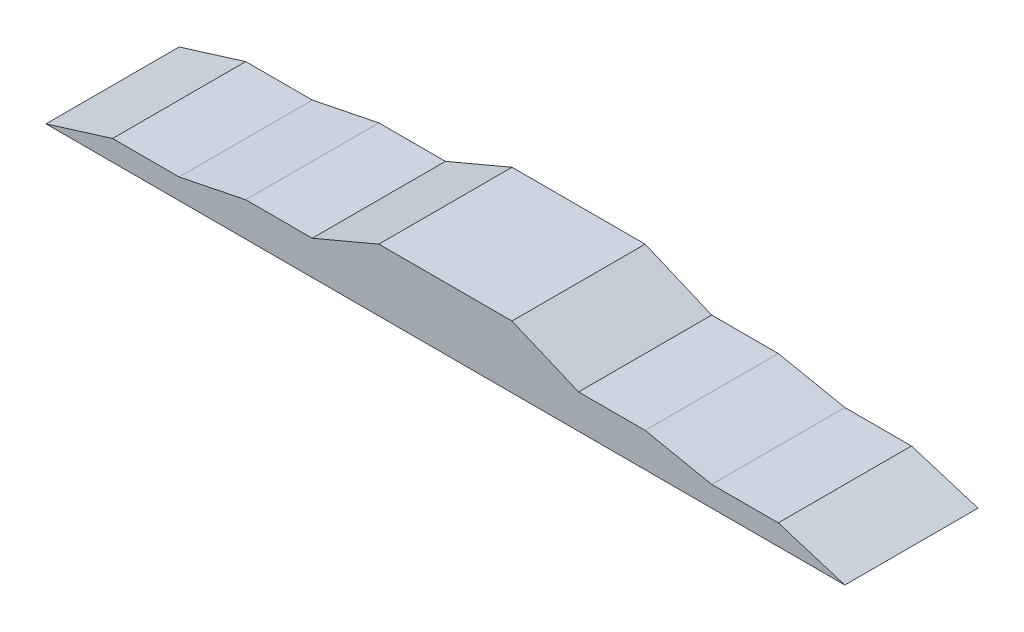
ISO-10303-21;
HEADER;
FILE_DESCRIPTION(('STEP AP214'),'2;1');
FILE_NAME('part.step','',(''),(''),'','','');
FILE_SCHEMA(('AUTOMOTIVE_DESIGN { 1 0 10303 214 1 1 1 1 }'));
ENDSEC;
DATA;
#1=APPLICATION_CONTEXT('core data for automotive mechanical design processes');
#2=APPLICATION_PROTOCOL_DEFINITION('international standard','automotive_design',2000,#1);
#3=PRODUCT_CONTEXT('',#1,'mechanical');
#4=PRODUCT('Part','Part','',(#3));
#5=PRODUCT_RELATED_PRODUCT_CATEGORY('part','',(#4));
#6=PRODUCT_DEFINITION_FORMATION('','',#4);
#7=PRODUCT_DEFINITION_CONTEXT('part definition',#1,'design');
#8=PRODUCT_DEFINITION('design','',#6,#7);
#9=PRODUCT_DEFINITION_SHAPE('','',#8);
#10=(LENGTH_UNIT() NAMED_UNIT(*) SI_UNIT(.MILLI.,.METRE.));
#11=(NAMED_UNIT(*) PLANE_ANGLE_UNIT() SI_UNIT($,.RADIAN.));
#12=(NAMED_UNIT(*) SI_UNIT($,.STERADIAN.) SOLID_ANGLE_UNIT());
#13=UNCERTAINTY_MEASURE_WITH_UNIT(LENGTH_MEASURE(1.E-05),#10,'distance_accuracy_value','');
#14=(GEOMETRIC_REPRESENTATION_CONTEXT(3) GLOBAL_UNCERTAINTY_ASSIGNED_CONTEXT((#13)) GLOBAL_UNIT_ASSIGNED_CONTEXT((#10,
#11,#12)) REPRESENTATION_CONTEXT('',''));
#15=CARTESIAN_POINT('',(0.,0.,0.));
#16=DIRECTION('',(0.,0.,1.));
#17=DIRECTION('',(1.,0.,0.));
#18=AXIS2_PLACEMENT_3D('',#15,#16,#17);
#19=CARTESIAN_POINT('',(200.,15.4668124804813,100.));
#20=DIRECTION('',(0.,-1.,0.));
#21=DIRECTION('',(1.,0.,0.));
#22=AXIS2_PLACEMENT_3D('',#19,#20,#21);
#23=PLANE('',#22);
#24=DIRECTION('',(-1.,0.,0.));
#25=VECTOR('',#24,1.);
#26=CARTESIAN_POINT('',(200.,15.4668124804813,0.));
#27=LINE('',#26,#25);
#28=CARTESIAN_POINT('',(250.,15.4668124804813,0.));
#29=VERTEX_POINT('',#28);
#30=CARTESIAN_POINT('',(200.,15.4668124804813,0.));
#31=VERTEX_POINT('',#30);
#32=EDGE_CURVE('E157',#29,#31,#27,.T.);
#33=ORIENTED_EDGE('',*,*,#32,.T.);
#34=DIRECTION('',(0.,0.,-1.));
#35=VECTOR('',#34,1.);
#36=CARTESIAN_POINT('',(200.,15.4668124804813,100.));
#37=LINE('',#36,#35);
#38=CARTESIAN_POINT('',(200.,15.4668124804813,100.));
#39=VERTEX_POINT('',#38);
#40=EDGE_CURVE('E11',#39,#31,#37,.T.);
#41=ORIENTED_EDGE('',*,*,#40,.F.);
#42=DIRECTION('',(-1.,0.,0.));
#43=VECTOR('',#42,1.);
#44=CARTESIAN_POINT('',(200.,15.4668124804813,100.));
#45=LINE('',#44,#43);
#46=CARTESIAN_POINT('',(250.,15.4668124804813,100.));
#47=VERTEX_POINT('',#46);
#48=EDGE_CURVE('E179',#47,#39,#45,.T.);
#49=ORIENTED_EDGE('',*,*,#48,.F.);
#50=DIRECTION('',(0.,0.,-1.));
#51=VECTOR('',#50,1.);
#52=CARTESIAN_POINT('',(250.,15.4668124804813,100.));
#53=LINE('',#52,#51);
#54=EDGE_CURVE('E153',#47,#29,#53,.T.);
#55=ORIENTED_EDGE('',*,*,#54,.T.);
#56=EDGE_LOOP('',(#33,#41,#49,#55));
#57=FACE_BOUND('',#56,.T.);
#58=ADVANCED_FACE('F37',(#57),#23,.F.);
#59=CARTESIAN_POINT('',(200.,15.4668124804813,100.));
#60=DIRECTION('',(-0.198669330795055,-0.980066577841243,0.));
#61=DIRECTION('',(0.980066577841243,-0.198669330795055,0.));
#62=AXIS2_PLACEMENT_3D('',#59,#60,#61);
#63=PLANE('',#62);
#64=DIRECTION('',(-0.980066577841243,0.198669330795055,0.));
#65=VECTOR('',#64,1.);
#66=CARTESIAN_POINT('',(200.,15.4668124804813,0.));
#67=LINE('',#66,#65);
#68=CARTESIAN_POINT('',(150.,25.6023142559146,0.));
#69=VERTEX_POINT('',#68);
#70=EDGE_CURVE('E160',#31,#69,#67,.T.);
#71=ORIENTED_EDGE('',*,*,#70,.T.);
#72=DIRECTION('',(0.,0.,-1.));
#73=VECTOR('',#72,1.);
#74=CARTESIAN_POINT('',(150.,25.6023142559146,100.));
#75=LINE('',#74,#73);
#76=CARTESIAN_POINT('',(150.,25.6023142559146,100.));
#77=VERTEX_POINT('',#76);
#78=EDGE_CURVE('E45',#77,#69,#75,.T.);
#79=ORIENTED_EDGE('',*,*,#78,.F.);
#80=DIRECTION('',(-0.980066577841243,0.198669330795055,0.));
#81=VECTOR('',#80,1.);
#82=CARTESIAN_POINT('',(200.,15.4668124804813,100.));
#83=LINE('',#82,#81);
#84=EDGE_CURVE('E108',#39,#77,#83,.T.);
#85=ORIENTED_EDGE('',*,*,#84,.F.);
#86=ORIENTED_EDGE('',*,*,#40,.T.);
#87=EDGE_LOOP('',(#71,#79,#85,#86));
#88=FACE_BOUND('',#87,.T.);
#89=ADVANCED_FACE('F257',(#88),#63,.F.);
#90=CARTESIAN_POINT('',(150.,25.6023142559146,100.));
#91=DIRECTION('',(0.,-1.,0.));
#92=DIRECTION('',(1.,0.,0.));
#93=AXIS2_PLACEMENT_3D('',#90,#91,#92);
#94=PLANE('',#93);
#95=DIRECTION('',(-1.,0.,0.));
#96=VECTOR('',#95,1.);
#97=CARTESIAN_POINT('',(150.,25.6023142559146,0.));
#98=LINE('',#97,#96);
#99=CARTESIAN_POINT('',(100.,25.6023142559146,0.));
#100=VERTEX_POINT('',#99);
#101=EDGE_CURVE('E162',#69,#100,#98,.T.);
#102=ORIENTED_EDGE('',*,*,#101,.T.);
#103=DIRECTION('',(0.,0.,-1.));
#104=VECTOR('',#103,1.);
#105=CARTESIAN_POINT('',(100.,25.6023142559146,100.));
#106=LINE('',#105,#104);
#107=CARTESIAN_POINT('',(100.,25.6023142559146,100.));
#108=VERTEX_POINT('',#107);
#109=EDGE_CURVE('E198',#108,#100,#106,.T.);
#110=ORIENTED_EDGE('',*,*,#109,.F.);
#111=DIRECTION('',(-1.,0.,0.));
#112=VECTOR('',#111,1.);
#113=CARTESIAN_POINT('',(150.,25.6023142559146,100.));
#114=LINE('',#113,#112);
#115=EDGE_CURVE('E206',#77,#108,#114,.T.);
#116=ORIENTED_EDGE('',*,*,#115,.F.);
#117=ORIENTED_EDGE('',*,*,#78,.T.);
#118=EDGE_LOOP('',(#102,#110,#116,#117));
#119=FACE_BOUND('',#118,.T.);
#120=ADVANCED_FACE('F204',(#119),#94,.F.);
#121=CARTESIAN_POINT('',(100.,25.6023142559146,100.));
#122=DIRECTION('',(-0.389418342308644,-0.921060994002888,0.));
#123=DIRECTION('',(0.921060994002888,-0.389418342308644,0.));
#124=AXIS2_PLACEMENT_3D('',#121,#122,#123);
#125=PLANE('',#124);
#126=DIRECTION('',(-0.921060994002888,0.389418342308644,0.));
#127=VECTOR('',#126,1.);
#128=CARTESIAN_POINT('',(100.,25.6023142559146,0.));
#129=LINE('',#128,#127);
#130=CARTESIAN_POINT('',(50.,46.7419751928223,0.));
#131=VERTEX_POINT('',#130);
#132=EDGE_CURVE('E164',#100,#131,#129,.T.);
#133=ORIENTED_EDGE('',*,*,#132,.T.);
#134=DIRECTION('',(0.,0.,-1.));
#135=VECTOR('',#134,1.);
#136=CARTESIAN_POINT('',(50.,46.7419751928223,100.));
#137=LINE('',#136,#135);
#138=CARTESIAN_POINT('',(50.,46.7419751928223,100.));
#139=VERTEX_POINT('',#138);
#140=EDGE_CURVE('E195',#139,#131,#137,.T.);
#141=ORIENTED_EDGE('',*,*,#140,.F.);
#142=DIRECTION('',(-0.921060994002888,0.389418342308644,0.));
#143=VECTOR('',#142,1.);
#144=CARTESIAN_POINT('',(100.,25.6023142559146,100.));
#145=LINE('',#144,#143);
#146=EDGE_CURVE('E224',#108,#139,#145,.T.);
#147=ORIENTED_EDGE('',*,*,#146,.F.);
#148=ORIENTED_EDGE('',*,*,#109,.T.);
#149=EDGE_LOOP('',(#133,#141,#147,#148));
#150=FACE_BOUND('',#149,.T.);
#151=ADVANCED_FACE('F215',(#150),#125,.F.);
#152=CARTESIAN_POINT('',(-50.,46.7419751928223,100.));
#153=DIRECTION('',(0.,-1.,0.));
#154=DIRECTION('',(0.,0.,-1.));
#155=AXIS2_PLACEMENT_3D('',#152,#153,#154);
#156=PLANE('',#155);
#157=DIRECTION('',(-1.,0.,0.));
#158=VECTOR('',#157,1.);
#159=CARTESIAN_POINT('',(-50.,46.7419751928223,0.));
#160=LINE('',#159,#158);
#161=CARTESIAN_POINT('',(-50.,46.7419751928223,0.));
#162=VERTEX_POINT('',#161);
#163=EDGE_CURVE('E166',#131,#162,#160,.T.);
#164=ORIENTED_EDGE('',*,*,#163,.T.);
#165=DIRECTION('',(0.,0.,-1.));
#166=VECTOR('',#165,1.);
#167=CARTESIAN_POINT('',(-50.,46.7419751928223,100.));
#168=LINE('',#167,#166);
#169=CARTESIAN_POINT('',(-50.,46.7419751928223,100.));
#170=VERTEX_POINT('',#169);
#171=EDGE_CURVE('E192',#170,#162,#168,.T.);
#172=ORIENTED_EDGE('',*,*,#171,.F.);
#173=DIRECTION('',(-1.,0.,0.));
#174=VECTOR('',#173,1.);
#175=CARTESIAN_POINT('',(-50.,46.7419751928223,100.));
#176=LINE('',#175,#174);
#177=EDGE_CURVE('E221',#139,#170,#176,.T.);
#178=ORIENTED_EDGE('',*,*,#177,.F.);
#179=ORIENTED_EDGE('',*,*,#140,.T.);
#180=EDGE_LOOP('',(#164,#172,#178,#179));
#181=FACE_BOUND('',#180,.T.);
#182=ADVANCED_FACE('F219',(#181),#156,.F.);
#183=CARTESIAN_POINT('',(-100.,25.6023142559146,100.));
#184=DIRECTION('',(0.389418342308644,-0.921060994002888,0.));
#185=DIRECTION('',(0.921060994002888,0.389418342308644,0.));
#186=AXIS2_PLACEMENT_3D('',#183,#184,#185);
#187=PLANE('',#186);
#188=DIRECTION('',(-0.921060994002888,-0.389418342308644,0.));
#189=VECTOR('',#188,1.);
#190=CARTESIAN_POINT('',(-100.,25.6023142559146,0.));
#191=LINE('',#190,#189);
#192=CARTESIAN_POINT('',(-100.,25.6023142559146,0.));
#193=VERTEX_POINT('',#192);
#194=EDGE_CURVE('E168',#162,#193,#191,.T.);
#195=ORIENTED_EDGE('',*,*,#194,.T.);
#196=DIRECTION('',(0.,0.,-1.));
#197=VECTOR('',#196,1.);
#198=CARTESIAN_POINT('',(-100.,25.6023142559146,100.));
#199=LINE('',#198,#197);
#200=CARTESIAN_POINT('',(-100.,25.6023142559146,100.));
#201=VERTEX_POINT('',#200);
#202=EDGE_CURVE('E189',#201,#193,#199,.T.);
#203=ORIENTED_EDGE('',*,*,#202,.F.);
#204=DIRECTION('',(-0.921060994002888,-0.389418342308644,0.));
#205=VECTOR('',#204,1.);
#206=CARTESIAN_POINT('',(-100.,25.6023142559146,100.));
#207=LINE('',#206,#205);
#208=EDGE_CURVE('E223',#170,#201,#207,.T.);
#209=ORIENTED_EDGE('',*,*,#208,.F.);
#210=ORIENTED_EDGE('',*,*,#171,.T.);
#211=EDGE_LOOP('',(#195,#203,#209,#210));
#212=FACE_BOUND('',#211,.T.);
#213=ADVANCED_FACE('F270',(#212),#187,.F.);
#214=CARTESIAN_POINT('',(-150.,25.6023142559146,100.));
#215=DIRECTION('',(0.,-1.,0.));
#216=DIRECTION('',(1.,0.,0.));
#217=AXIS2_PLACEMENT_3D('',#214,#215,#216);
#218=PLANE('',#217);
#219=DIRECTION('',(-1.,0.,0.));
#220=VECTOR('',#219,1.);
#221=CARTESIAN_POINT('',(-150.,25.6023142559146,0.));
#222=LINE('',#221,#220);
#223=CARTESIAN_POINT('',(-150.,25.6023142559146,0.));
#224=VERTEX_POINT('',#223);
#225=EDGE_CURVE('E170',#193,#224,#222,.T.);
#226=ORIENTED_EDGE('',*,*,#225,.T.);
#227=DIRECTION('',(0.,0.,-1.));
#228=VECTOR('',#227,1.);
#229=CARTESIAN_POINT('',(-150.,25.6023142559146,100.));
#230=LINE('',#229,#228);
#231=CARTESIAN_POINT('',(-150.,25.6023142559146,100.));
#232=VERTEX_POINT('',#231);
#233=EDGE_CURVE('E186',#232,#224,#230,.T.);
#234=ORIENTED_EDGE('',*,*,#233,.F.);
#235=DIRECTION('',(-1.,0.,0.));
#236=VECTOR('',#235,1.);
#237=CARTESIAN_POINT('',(-150.,25.6023142559146,100.));
#238=LINE('',#237,#236);
#239=EDGE_CURVE('E226',#201,#232,#238,.T.);
#240=ORIENTED_EDGE('',*,*,#239,.F.);
#241=ORIENTED_EDGE('',*,*,#202,.T.);
#242=EDGE_LOOP('',(#226,#234,#240,#241));
#243=FACE_BOUND('',#242,.T.);
#244=ADVANCED_FACE('F273',(#243),#218,.F.);
#245=CARTESIAN_POINT('',(-200.,15.4668124804813,100.));
#246=DIRECTION('',(0.198669330795055,-0.980066577841243,0.));
#247=DIRECTION('',(0.980066577841243,0.198669330795055,0.));
#248=AXIS2_PLACEMENT_3D('',#245,#246,#247);
#249=PLANE('',#248);
#250=DIRECTION('',(-0.980066577841243,-0.198669330795055,0.));
#251=VECTOR('',#250,1.);
#252=CARTESIAN_POINT('',(-200.,15.4668124804813,0.));
#253=LINE('',#252,#251);
#254=CARTESIAN_POINT('',(-200.,15.4668124804813,0.));
#255=VERTEX_POINT('',#254);
#256=EDGE_CURVE('E172',#224,#255,#253,.T.);
#257=ORIENTED_EDGE('',*,*,#256,.T.);
#258=DIRECTION('',(0.,0.,-1.));
#259=VECTOR('',#258,1.);
#260=CARTESIAN_POINT('',(-200.,15.4668124804813,100.));
#261=LINE('',#260,#259);
#262=CARTESIAN_POINT('',(-200.,15.4668124804813,100.));
#263=VERTEX_POINT('',#262);
#264=EDGE_CURVE('E183',#263,#255,#261,.T.);
#265=ORIENTED_EDGE('',*,*,#264,.F.);
#266=DIRECTION('',(-0.980066577841243,-0.198669330795055,0.));
#267=VECTOR('',#266,1.);
#268=CARTESIAN_POINT('',(-200.,15.4668124804813,100.));
#269=LINE('',#268,#267);
#270=EDGE_CURVE('E232',#232,#263,#269,.T.);
#271=ORIENTED_EDGE('',*,*,#270,.F.);
#272=ORIENTED_EDGE('',*,*,#233,.T.);
#273=EDGE_LOOP('',(#257,#265,#271,#272));
#274=FACE_BOUND('',#273,.T.);
#275=ADVANCED_FACE('F238',(#274),#249,.F.);
#276=CARTESIAN_POINT('',(-200.,15.4668124804813,100.));
#277=DIRECTION('',(0.,-1.,0.));
#278=DIRECTION('',(1.,0.,0.));
#279=AXIS2_PLACEMENT_3D('',#276,#277,#278);
#280=PLANE('',#279);
#281=DIRECTION('',(-1.,0.,0.));
#282=VECTOR('',#281,1.);
#283=CARTESIAN_POINT('',(-200.,15.4668124804813,0.));
#284=LINE('',#283,#282);
#285=CARTESIAN_POINT('',(-250.,15.4668124804813,0.));
#286=VERTEX_POINT('',#285);
#287=EDGE_CURVE('E174',#255,#286,#284,.T.);
#288=ORIENTED_EDGE('',*,*,#287,.T.);
#289=DIRECTION('',(0.,0.,-1.));
#290=VECTOR('',#289,1.);
#291=CARTESIAN_POINT('',(-250.,15.4668124804813,100.));
#292=LINE('',#291,#290);
#293=CARTESIAN_POINT('',(-250.,15.4668124804813,100.));
#294=VERTEX_POINT('',#293);
#295=EDGE_CURVE('E148',#294,#286,#292,.T.);
#296=ORIENTED_EDGE('',*,*,#295,.F.);
#297=DIRECTION('',(-1.,0.,0.));
#298=VECTOR('',#297,1.);
#299=CARTESIAN_POINT('',(-200.,15.4668124804813,100.));
#300=LINE('',#299,#298);
#301=EDGE_CURVE('E139',#263,#294,#300,.T.);
#302=ORIENTED_EDGE('',*,*,#301,.F.);
#303=ORIENTED_EDGE('',*,*,#264,.T.);
#304=EDGE_LOOP('',(#288,#296,#302,#303));
#305=FACE_BOUND('',#304,.T.);
#306=ADVANCED_FACE('F242',(#305),#280,.F.);
#307=CARTESIAN_POINT('',(-250.,15.4668124804813,100.));
#308=DIRECTION('',(0.29552020666134,-0.955336489125606,0.));
#309=DIRECTION('',(0.955336489125606,0.29552020666134,0.));
#310=AXIS2_PLACEMENT_3D('',#307,#308,#309);
#311=PLANE('',#310);
#312=DIRECTION('',(-0.955336489125606,-0.29552020666134,0.));
#313=VECTOR('',#312,1.);
#314=CARTESIAN_POINT('',(-250.,15.4668124804813,0.));
#315=LINE('',#314,#313);
#316=CARTESIAN_POINT('',(-300.,0.,0.));
#317=VERTEX_POINT('',#316);
#318=EDGE_CURVE('E147',#286,#317,#315,.T.);
#319=ORIENTED_EDGE('',*,*,#318,.T.);
#320=DIRECTION('',(0.,0.,-1.));
#321=VECTOR('',#320,1.);
#322=CARTESIAN_POINT('',(-300.,0.,100.));
#323=LINE('',#322,#321);
#324=CARTESIAN_POINT('',(-300.,0.,100.));
#325=VERTEX_POINT('',#324);
#326=EDGE_CURVE('E144',#325,#317,#323,.T.);
#327=ORIENTED_EDGE('',*,*,#326,.F.);
#328=DIRECTION('',(-0.955336489125606,-0.29552020666134,0.));
#329=VECTOR('',#328,1.);
#330=CARTESIAN_POINT('',(-250.,15.4668124804813,100.));
#331=LINE('',#330,#329);
#332=EDGE_CURVE('E133',#294,#325,#331,.T.);
#333=ORIENTED_EDGE('',*,*,#332,.F.);
#334=ORIENTED_EDGE('',*,*,#295,.T.);
#335=EDGE_LOOP('',(#319,#327,#333,#334));
#336=FACE_BOUND('',#335,.T.);
#337=ADVANCED_FACE('F145',(#336),#311,.F.);
#338=CARTESIAN_POINT('',(-300.,0.,100.));
#339=DIRECTION('',(0.,1.,0.));
#340=DIRECTION('',(0.,0.,1.));
#341=AXIS2_PLACEMENT_3D('',#338,#339,#340);
#342=PLANE('',#341);
#343=DIRECTION('',(1.,0.,0.));
#344=VECTOR('',#343,1.);
#345=CARTESIAN_POINT('',(-300.,0.,0.));
#346=LINE('',#345,#344);
#347=CARTESIAN_POINT('',(300.,0.,0.));
#348=VERTEX_POINT('',#347);
#349=EDGE_CURVE('E94',#317,#348,#346,.T.);
#350=ORIENTED_EDGE('',*,*,#349,.T.);
#351=DIRECTION('',(0.,0.,-1.));
#352=VECTOR('',#351,1.);
#353=CARTESIAN_POINT('',(300.,0.,100.));
#354=LINE('',#353,#352);
#355=CARTESIAN_POINT('',(300.,0.,100.));
#356=VERTEX_POINT('',#355);
#357=EDGE_CURVE('E149',#356,#348,#354,.T.);
#358=ORIENTED_EDGE('',*,*,#357,.F.);
#359=DIRECTION('',(1.,0.,0.));
#360=VECTOR('',#359,1.);
#361=CARTESIAN_POINT('',(-300.,0.,100.));
#362=LINE('',#361,#360);
#363=EDGE_CURVE('E137',#325,#356,#362,.T.);
#364=ORIENTED_EDGE('',*,*,#363,.F.);
#365=ORIENTED_EDGE('',*,*,#326,.T.);
#366=EDGE_LOOP('',(#350,#358,#364,#365));
#367=FACE_BOUND('',#366,.T.);
#368=ADVANCED_FACE('F151',(#367),#342,.F.);
#369=CARTESIAN_POINT('',(250.,15.4668124804813,100.));
#370=DIRECTION('',(-0.29552020666134,-0.955336489125606,0.));
#371=DIRECTION('',(0.955336489125606,-0.29552020666134,0.));
#372=AXIS2_PLACEMENT_3D('',#369,#370,#371);
#373=PLANE('',#372);
#374=DIRECTION('',(-0.955336489125606,0.29552020666134,0.));
#375=VECTOR('',#374,1.);
#376=CARTESIAN_POINT('',(250.,15.4668124804813,0.));
#377=LINE('',#376,#375);
#378=EDGE_CURVE('E100',#348,#29,#377,.T.);
#379=ORIENTED_EDGE('',*,*,#378,.T.);
#380=ORIENTED_EDGE('',*,*,#54,.F.);
#381=DIRECTION('',(-0.955336489125606,0.29552020666134,0.));
#382=VECTOR('',#381,1.);
#383=CARTESIAN_POINT('',(250.,15.4668124804813,100.));
#384=LINE('',#383,#382);
#385=EDGE_CURVE('E53',#356,#47,#384,.T.);
#386=ORIENTED_EDGE('',*,*,#385,.F.);
#387=ORIENTED_EDGE('',*,*,#357,.T.);
#388=EDGE_LOOP('',(#379,#380,#386,#387));
#389=FACE_BOUND('',#388,.T.);
#390=ADVANCED_FACE('F246',(#389),#373,.F.);
#391=CARTESIAN_POINT('',(0.,0.,100.));
#392=DIRECTION('',(0.,0.,1.));
#393=DIRECTION('',(1.,0.,0.));
#394=AXIS2_PLACEMENT_3D('',#391,#392,#393);
#395=PLANE('',#394);
#396=ORIENTED_EDGE('',*,*,#48,.T.);
#397=ORIENTED_EDGE('',*,*,#84,.T.);
#398=ORIENTED_EDGE('',*,*,#115,.T.);
#399=ORIENTED_EDGE('',*,*,#146,.T.);
#400=ORIENTED_EDGE('',*,*,#177,.T.);
#401=ORIENTED_EDGE('',*,*,#208,.T.);
#402=ORIENTED_EDGE('',*,*,#239,.T.);
#403=ORIENTED_EDGE('',*,*,#270,.T.);
#404=ORIENTED_EDGE('',*,*,#301,.T.);
#405=ORIENTED_EDGE('',*,*,#332,.T.);
#406=ORIENTED_EDGE('',*,*,#363,.T.);
#407=ORIENTED_EDGE('',*,*,#385,.T.);
#408=EDGE_LOOP('',(#396,#397,#398,#399,#400,#401,#402,#403,#404,#405,#406,#407));
#409=FACE_BOUND('',#408,.T.);
#410=ADVANCED_FACE('F135',(#409),#395,.T.);
#411=CARTESIAN_POINT('',(0.,0.,0.));
#412=DIRECTION('',(0.,0.,1.));
#413=DIRECTION('',(1.,0.,0.));
#414=AXIS2_PLACEMENT_3D('',#411,#412,#413);
#415=PLANE('',#414);
#416=ORIENTED_EDGE('',*,*,#32,.F.);
#417=ORIENTED_EDGE('',*,*,#378,.F.);
#418=ORIENTED_EDGE('',*,*,#349,.F.);
#419=ORIENTED_EDGE('',*,*,#318,.F.);
#420=ORIENTED_EDGE('',*,*,#287,.F.);
#421=ORIENTED_EDGE('',*,*,#256,.F.);
#422=ORIENTED_EDGE('',*,*,#225,.F.);
#423=ORIENTED_EDGE('',*,*,#194,.F.);
#424=ORIENTED_EDGE('',*,*,#163,.F.);
#425=ORIENTED_EDGE('',*,*,#132,.F.);
#426=ORIENTED_EDGE('',*,*,#101,.F.);
#427=ORIENTED_EDGE('',*,*,#70,.F.);
#428=EDGE_LOOP('',(#416,#417,#418,#419,#420,#421,#422,#423,#424,#425,#426,#427));
#429=FACE_BOUND('',#428,.T.);
#430=ADVANCED_FACE('F210',(#429),#415,.F.);
#431=CLOSED_SHELL('',(#58,#89,#120,#151,#182,#213,#244,#275,#306,#337,#368,#390,#410,#430));
#432=MANIFOLD_SOLID_BREP('B2',#431);
#433=ADVANCED_BREP_SHAPE_REPRESENTATION('',(#18,#432),#14);
#434=SHAPE_DEFINITION_REPRESENTATION(#9,#433);
ENDSEC;
END-ISO-10303-21;
